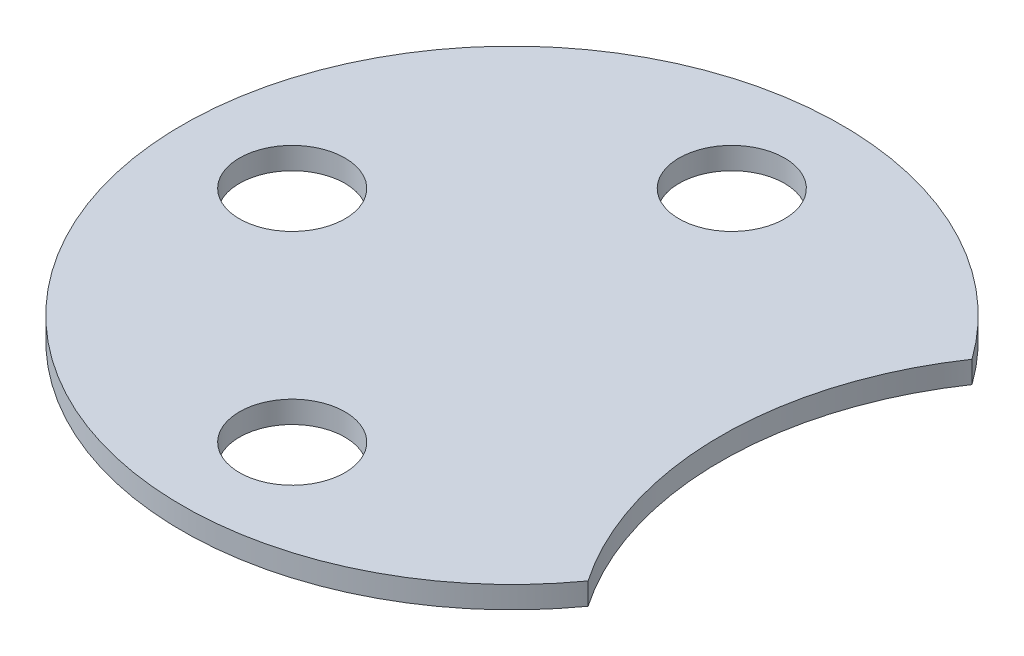
ISO-10303-21;
HEADER;
FILE_DESCRIPTION(('STEP AP214'),'2;1');
FILE_NAME('part.step','',(''),(''),'','','');
FILE_SCHEMA(('AUTOMOTIVE_DESIGN { 1 0 10303 214 1 1 1 1 }'));
ENDSEC;
DATA;
#1=APPLICATION_CONTEXT('core data for automotive mechanical design processes');
#2=APPLICATION_PROTOCOL_DEFINITION('international standard','automotive_design',2000,#1);
#3=PRODUCT_CONTEXT('',#1,'mechanical');
#4=PRODUCT('Part','Part','',(#3));
#5=PRODUCT_RELATED_PRODUCT_CATEGORY('part','',(#4));
#6=PRODUCT_DEFINITION_FORMATION('','',#4);
#7=PRODUCT_DEFINITION_CONTEXT('part definition',#1,'design');
#8=PRODUCT_DEFINITION('design','',#6,#7);
#9=PRODUCT_DEFINITION_SHAPE('','',#8);
#10=(LENGTH_UNIT() NAMED_UNIT(*) SI_UNIT(.MILLI.,.METRE.));
#11=(NAMED_UNIT(*) PLANE_ANGLE_UNIT() SI_UNIT($,.RADIAN.));
#12=(NAMED_UNIT(*) SI_UNIT($,.STERADIAN.) SOLID_ANGLE_UNIT());
#13=UNCERTAINTY_MEASURE_WITH_UNIT(LENGTH_MEASURE(1.E-05),#10,'distance_accuracy_value','');
#14=(GEOMETRIC_REPRESENTATION_CONTEXT(3) GLOBAL_UNCERTAINTY_ASSIGNED_CONTEXT((#13)) GLOBAL_UNIT_ASSIGNED_CONTEXT((#10,
#11,#12)) REPRESENTATION_CONTEXT('',''));
#15=CARTESIAN_POINT('',(0.,0.,0.));
#16=DIRECTION('',(0.,0.,1.));
#17=DIRECTION('',(1.,0.,0.));
#18=AXIS2_PLACEMENT_3D('',#15,#16,#17);
#19=CARTESIAN_POINT('',(0.,0.,0.));
#20=DIRECTION('',(0.,1.,0.));
#21=DIRECTION('',(0.,0.,1.));
#22=AXIS2_PLACEMENT_3D('',#19,#20,#21);
#23=PLANE('',#22);
#24=CARTESIAN_POINT('',(-50.,0.,3.49148133884313E-13));
#25=DIRECTION('',(0.,-1.,0.));
#26=DIRECTION('',(0.,0.,-1.));
#27=AXIS2_PLACEMENT_3D('',#24,#25,#26);
#28=CIRCLE('',#27,12.);
#29=CARTESIAN_POINT('',(-50.,0.,-11.9999999999997));
#30=VERTEX_POINT('',#29);
#31=EDGE_CURVE('E98',#30,#30,#28,.T.);
#32=ORIENTED_EDGE('',*,*,#31,.F.);
#33=EDGE_LOOP('',(#32));
#34=FACE_BOUND('',#33,.T.);
#35=CARTESIAN_POINT('',(5.2372220082647E-13,0.,50.));
#36=DIRECTION('',(0.,-1.,0.));
#37=DIRECTION('',(0.,0.,-1.));
#38=AXIS2_PLACEMENT_3D('',#35,#36,#37);
#39=CIRCLE('',#38,12.);
#40=CARTESIAN_POINT('',(5.2372220082647E-13,0.,38.));
#41=VERTEX_POINT('',#40);
#42=EDGE_CURVE('E92',#41,#41,#39,.T.);
#43=ORIENTED_EDGE('',*,*,#42,.F.);
#44=EDGE_LOOP('',(#43));
#45=FACE_BOUND('',#44,.T.);
#46=CARTESIAN_POINT('',(0.,0.,0.));
#47=DIRECTION('',(0.,1.,0.));
#48=DIRECTION('',(0.,0.,1.));
#49=AXIS2_PLACEMENT_3D('',#46,#47,#48);
#50=CIRCLE('',#49,75.);
#51=CARTESIAN_POINT('',(60.975,0.,-43.6697764477905));
#52=VERTEX_POINT('',#51);
#53=CARTESIAN_POINT('',(60.975,0.,43.6697764477905));
#54=VERTEX_POINT('',#53);
#55=EDGE_CURVE('E43',#52,#54,#50,.T.);
#56=ORIENTED_EDGE('',*,*,#55,.F.);
#57=CARTESIAN_POINT('',(125.,0.,0.));
#58=DIRECTION('',(0.,-1.,0.));
#59=DIRECTION('',(0.,0.,-1.));
#60=AXIS2_PLACEMENT_3D('',#57,#58,#59);
#61=CIRCLE('',#60,77.5);
#62=EDGE_CURVE('E59',#54,#52,#61,.T.);
#63=ORIENTED_EDGE('',*,*,#62,.F.);
#64=EDGE_LOOP('',(#56,#63));
#65=FACE_BOUND('',#64,.T.);
#66=CARTESIAN_POINT('',(-1.74574066942157E-13,0.,-50.));
#67=DIRECTION('',(0.,-1.,0.));
#68=DIRECTION('',(0.,0.,-1.));
#69=AXIS2_PLACEMENT_3D('',#66,#67,#68);
#70=CIRCLE('',#69,12.);
#71=CARTESIAN_POINT('',(-1.74574066942157E-13,0.,-62.));
#72=VERTEX_POINT('',#71);
#73=EDGE_CURVE('E73',#72,#72,#70,.T.);
#74=ORIENTED_EDGE('',*,*,#73,.F.);
#75=EDGE_LOOP('',(#74));
#76=FACE_BOUND('',#75,.T.);
#77=ADVANCED_FACE('F39',(#34,#45,#65,#76),#23,.F.);
#78=CARTESIAN_POINT('',(0.,5.,0.));
#79=DIRECTION('',(0.,-1.,0.));
#80=DIRECTION('',(0.,0.,-1.));
#81=AXIS2_PLACEMENT_3D('',#78,#79,#80);
#82=CYLINDRICAL_SURFACE('',#81,75.);
#83=ORIENTED_EDGE('',*,*,#55,.T.);
#84=DIRECTION('',(0.,-1.,0.));
#85=VECTOR('',#84,1.);
#86=CARTESIAN_POINT('',(60.975,2.5,43.6697764477905));
#87=LINE('',#86,#85);
#88=CARTESIAN_POINT('',(60.975,5.,43.6697764477905));
#89=VERTEX_POINT('',#88);
#90=EDGE_CURVE('E66',#54,#89,#87,.F.);
#91=ORIENTED_EDGE('',*,*,#90,.T.);
#92=CARTESIAN_POINT('',(0.,5.,0.));
#93=DIRECTION('',(0.,1.,0.));
#94=DIRECTION('',(0.,0.,1.));
#95=AXIS2_PLACEMENT_3D('',#92,#93,#94);
#96=CIRCLE('',#95,75.);
#97=CARTESIAN_POINT('',(60.975,5.,-43.6697764477905));
#98=VERTEX_POINT('',#97);
#99=EDGE_CURVE('E11',#98,#89,#96,.T.);
#100=ORIENTED_EDGE('',*,*,#99,.F.);
#101=DIRECTION('',(0.,-1.,0.));
#102=VECTOR('',#101,1.);
#103=CARTESIAN_POINT('',(60.975,2.5,-43.6697764477905));
#104=LINE('',#103,#102);
#105=EDGE_CURVE('E54',#98,#52,#104,.T.);
#106=ORIENTED_EDGE('',*,*,#105,.T.);
#107=EDGE_LOOP('',(#83,#91,#100,#106));
#108=FACE_BOUND('',#107,.T.);
#109=ADVANCED_FACE('F41',(#108),#82,.T.);
#110=CARTESIAN_POINT('',(0.,5.,0.));
#111=DIRECTION('',(0.,1.,0.));
#112=DIRECTION('',(0.,0.,1.));
#113=AXIS2_PLACEMENT_3D('',#110,#111,#112);
#114=PLANE('',#113);
#115=CARTESIAN_POINT('',(125.,5.,0.));
#116=DIRECTION('',(0.,-1.,0.));
#117=DIRECTION('',(0.,0.,-1.));
#118=AXIS2_PLACEMENT_3D('',#115,#116,#117);
#119=CIRCLE('',#118,77.5);
#120=EDGE_CURVE('E63',#89,#98,#119,.T.);
#121=ORIENTED_EDGE('',*,*,#120,.T.);
#122=ORIENTED_EDGE('',*,*,#99,.T.);
#123=EDGE_LOOP('',(#121,#122));
#124=FACE_BOUND('',#123,.T.);
#125=CARTESIAN_POINT('',(-1.74574066942157E-13,5.,-50.));
#126=DIRECTION('',(0.,-1.,0.));
#127=DIRECTION('',(0.,0.,-1.));
#128=AXIS2_PLACEMENT_3D('',#125,#126,#127);
#129=CIRCLE('',#128,12.);
#130=CARTESIAN_POINT('',(-1.74574066942157E-13,5.,-62.));
#131=VERTEX_POINT('',#130);
#132=EDGE_CURVE('E83',#131,#131,#129,.T.);
#133=ORIENTED_EDGE('',*,*,#132,.T.);
#134=EDGE_LOOP('',(#133));
#135=FACE_BOUND('',#134,.T.);
#136=CARTESIAN_POINT('',(-50.,5.,3.49148133884313E-13));
#137=DIRECTION('',(0.,-1.,0.));
#138=DIRECTION('',(0.,0.,-1.));
#139=AXIS2_PLACEMENT_3D('',#136,#137,#138);
#140=CIRCLE('',#139,12.);
#141=CARTESIAN_POINT('',(-50.,5.,-11.9999999999997));
#142=VERTEX_POINT('',#141);
#143=EDGE_CURVE('E87',#142,#142,#140,.T.);
#144=ORIENTED_EDGE('',*,*,#143,.T.);
#145=EDGE_LOOP('',(#144));
#146=FACE_BOUND('',#145,.T.);
#147=CARTESIAN_POINT('',(5.2372220082647E-13,5.,50.));
#148=DIRECTION('',(0.,-1.,0.));
#149=DIRECTION('',(0.,0.,-1.));
#150=AXIS2_PLACEMENT_3D('',#147,#148,#149);
#151=CIRCLE('',#150,12.);
#152=CARTESIAN_POINT('',(5.2372220082647E-13,5.,38.));
#153=VERTEX_POINT('',#152);
#154=EDGE_CURVE('E90',#153,#153,#151,.T.);
#155=ORIENTED_EDGE('',*,*,#154,.T.);
#156=EDGE_LOOP('',(#155));
#157=FACE_BOUND('',#156,.T.);
#158=ADVANCED_FACE('F75',(#124,#135,#146,#157),#114,.T.);
#159=CARTESIAN_POINT('',(5.2372220082647E-13,0.,50.));
#160=DIRECTION('',(0.,-1.,0.));
#161=DIRECTION('',(0.,0.,-1.));
#162=AXIS2_PLACEMENT_3D('',#159,#160,#161);
#163=CYLINDRICAL_SURFACE('',#162,12.);
#164=ORIENTED_EDGE('',*,*,#154,.F.);
#165=EDGE_LOOP('',(#164));
#166=FACE_BOUND('',#165,.T.);
#167=ORIENTED_EDGE('',*,*,#42,.T.);
#168=EDGE_LOOP('',(#167));
#169=FACE_BOUND('',#168,.T.);
#170=ADVANCED_FACE('F78',(#166,#169),#163,.F.);
#171=CARTESIAN_POINT('',(-50.,0.,3.49148133884313E-13));
#172=DIRECTION('',(0.,-1.,0.));
#173=DIRECTION('',(0.,0.,-1.));
#174=AXIS2_PLACEMENT_3D('',#171,#172,#173);
#175=CYLINDRICAL_SURFACE('',#174,12.);
#176=ORIENTED_EDGE('',*,*,#143,.F.);
#177=EDGE_LOOP('',(#176));
#178=FACE_BOUND('',#177,.T.);
#179=ORIENTED_EDGE('',*,*,#31,.T.);
#180=EDGE_LOOP('',(#179));
#181=FACE_BOUND('',#180,.T.);
#182=ADVANCED_FACE('F113',(#178,#181),#175,.F.);
#183=CARTESIAN_POINT('',(-1.74574066942157E-13,0.,-50.));
#184=DIRECTION('',(0.,-1.,0.));
#185=DIRECTION('',(0.,0.,-1.));
#186=AXIS2_PLACEMENT_3D('',#183,#184,#185);
#187=CYLINDRICAL_SURFACE('',#186,12.);
#188=ORIENTED_EDGE('',*,*,#132,.F.);
#189=EDGE_LOOP('',(#188));
#190=FACE_BOUND('',#189,.T.);
#191=ORIENTED_EDGE('',*,*,#73,.T.);
#192=EDGE_LOOP('',(#191));
#193=FACE_BOUND('',#192,.T.);
#194=ADVANCED_FACE('F111',(#190,#193),#187,.F.);
#195=CARTESIAN_POINT('',(125.,5.,0.));
#196=DIRECTION('',(0.,-1.,0.));
#197=DIRECTION('',(0.,0.,-1.));
#198=AXIS2_PLACEMENT_3D('',#195,#196,#197);
#199=CYLINDRICAL_SURFACE('',#198,77.5);
#200=ORIENTED_EDGE('',*,*,#62,.T.);
#201=ORIENTED_EDGE('',*,*,#105,.F.);
#202=ORIENTED_EDGE('',*,*,#120,.F.);
#203=ORIENTED_EDGE('',*,*,#90,.F.);
#204=EDGE_LOOP('',(#200,#201,#202,#203));
#205=FACE_BOUND('',#204,.T.);
#206=ADVANCED_FACE('F65',(#205),#199,.F.);
#207=CLOSED_SHELL('',(#77,#109,#158,#170,#182,#194,#206));
#208=MANIFOLD_SOLID_BREP('B2',#207);
#209=ADVANCED_BREP_SHAPE_REPRESENTATION('',(#18,#208),#14);
#210=SHAPE_DEFINITION_REPRESENTATION(#9,#209);
ENDSEC;
END-ISO-10303-21;
